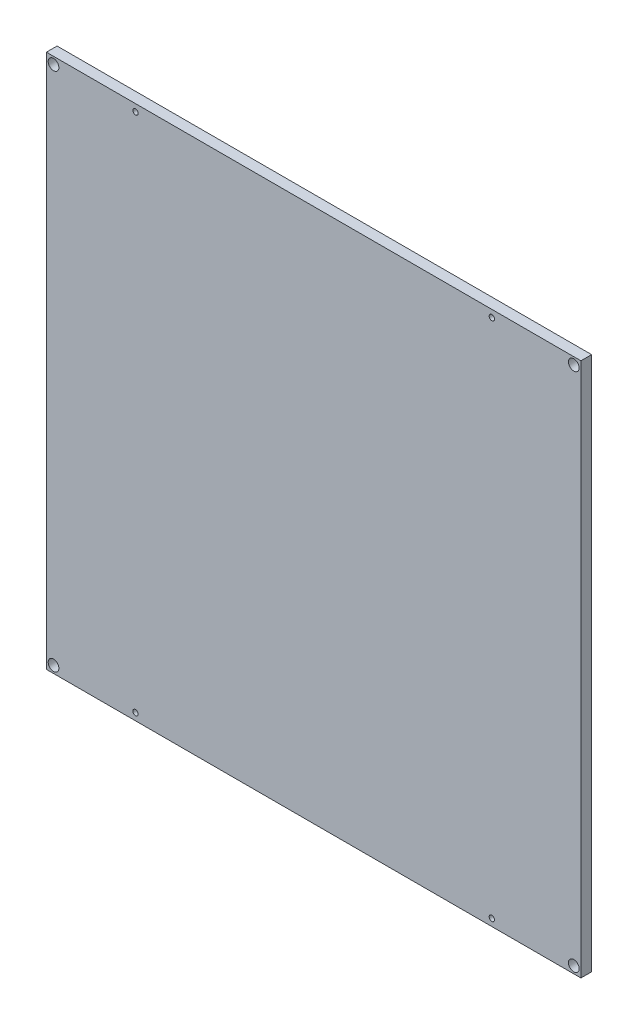
ISO-10303-21;
HEADER;
FILE_DESCRIPTION(('STEP AP214'),'2;1');
FILE_NAME('part.step','',(''),(''),'','','');
FILE_SCHEMA(('AUTOMOTIVE_DESIGN { 1 0 10303 214 1 1 1 1 }'));
ENDSEC;
DATA;
#1=APPLICATION_CONTEXT('core data for automotive mechanical design processes');
#2=APPLICATION_PROTOCOL_DEFINITION('international standard','automotive_design',2000,#1);
#3=PRODUCT_CONTEXT('',#1,'mechanical');
#4=PRODUCT('Part','Part','',(#3));
#5=PRODUCT_RELATED_PRODUCT_CATEGORY('part','',(#4));
#6=PRODUCT_DEFINITION_FORMATION('','',#4);
#7=PRODUCT_DEFINITION_CONTEXT('part definition',#1,'design');
#8=PRODUCT_DEFINITION('design','',#6,#7);
#9=PRODUCT_DEFINITION_SHAPE('','',#8);
#10=(LENGTH_UNIT() NAMED_UNIT(*) SI_UNIT(.MILLI.,.METRE.));
#11=(NAMED_UNIT(*) PLANE_ANGLE_UNIT() SI_UNIT($,.RADIAN.));
#12=(NAMED_UNIT(*) SI_UNIT($,.STERADIAN.) SOLID_ANGLE_UNIT());
#13=UNCERTAINTY_MEASURE_WITH_UNIT(LENGTH_MEASURE(1.E-05),#10,'distance_accuracy_value','');
#14=(GEOMETRIC_REPRESENTATION_CONTEXT(3) GLOBAL_UNCERTAINTY_ASSIGNED_CONTEXT((#13)) GLOBAL_UNIT_ASSIGNED_CONTEXT((#10,
#11,#12)) REPRESENTATION_CONTEXT('',''));
#15=CARTESIAN_POINT('',(0.,0.,0.));
#16=DIRECTION('',(0.,0.,1.));
#17=DIRECTION('',(1.,0.,0.));
#18=AXIS2_PLACEMENT_3D('',#15,#16,#17);
#19=CARTESIAN_POINT('',(0.,0.,6.));
#20=DIRECTION('',(0.,0.,-1.));
#21=DIRECTION('',(-1.,0.,0.));
#22=AXIS2_PLACEMENT_3D('',#19,#20,#21);
#23=PLANE('',#22);
#24=CARTESIAN_POINT('',(-146.,-146.,6.));
#25=DIRECTION('',(0.,0.,1.));
#26=DIRECTION('',(-1.,0.,0.));
#27=AXIS2_PLACEMENT_3D('',#24,#25,#26);
#28=CIRCLE('',#27,2.99999999999999);
#29=CARTESIAN_POINT('',(-149.,-146.,6.));
#30=VERTEX_POINT('',#29);
#31=EDGE_CURVE('E132',#30,#30,#28,.T.);
#32=ORIENTED_EDGE('',*,*,#31,.F.);
#33=EDGE_LOOP('',(#32));
#34=FACE_BOUND('',#33,.T.);
#35=CARTESIAN_POINT('',(100.,146.,6.));
#36=DIRECTION('',(0.,0.,-1.));
#37=DIRECTION('',(-1.,0.,0.));
#38=AXIS2_PLACEMENT_3D('',#35,#36,#37);
#39=CIRCLE('',#38,1.5);
#40=CARTESIAN_POINT('',(98.5,146.,6.));
#41=VERTEX_POINT('',#40);
#42=EDGE_CURVE('E126',#41,#41,#39,.T.);
#43=ORIENTED_EDGE('',*,*,#42,.T.);
#44=EDGE_LOOP('',(#43));
#45=FACE_BOUND('',#44,.T.);
#46=CARTESIAN_POINT('',(-100.,146.,6.));
#47=DIRECTION('',(0.,0.,1.));
#48=DIRECTION('',(1.,0.,0.));
#49=AXIS2_PLACEMENT_3D('',#46,#47,#48);
#50=CIRCLE('',#49,1.5);
#51=CARTESIAN_POINT('',(-98.5,146.,6.));
#52=VERTEX_POINT('',#51);
#53=EDGE_CURVE('E114',#52,#52,#50,.T.);
#54=ORIENTED_EDGE('',*,*,#53,.F.);
#55=EDGE_LOOP('',(#54));
#56=FACE_BOUND('',#55,.T.);
#57=CARTESIAN_POINT('',(-146.,146.,6.));
#58=DIRECTION('',(0.,0.,-1.));
#59=DIRECTION('',(-1.,0.,0.));
#60=AXIS2_PLACEMENT_3D('',#57,#58,#59);
#61=CIRCLE('',#60,2.99999999999999);
#62=CARTESIAN_POINT('',(-149.,146.,6.));
#63=VERTEX_POINT('',#62);
#64=EDGE_CURVE('E99',#63,#63,#61,.T.);
#65=ORIENTED_EDGE('',*,*,#64,.T.);
#66=EDGE_LOOP('',(#65));
#67=FACE_BOUND('',#66,.T.);
#68=DIRECTION('',(0.,1.,0.));
#69=VECTOR('',#68,1.);
#70=CARTESIAN_POINT('',(150.,-150.,6.));
#71=LINE('',#70,#69);
#72=CARTESIAN_POINT('',(150.,-150.,6.));
#73=VERTEX_POINT('',#72);
#74=CARTESIAN_POINT('',(150.,150.,6.));
#75=VERTEX_POINT('',#74);
#76=EDGE_CURVE('E84',#73,#75,#71,.T.);
#77=ORIENTED_EDGE('',*,*,#76,.T.);
#78=DIRECTION('',(-1.,0.,0.));
#79=VECTOR('',#78,1.);
#80=CARTESIAN_POINT('',(-150.,150.,6.));
#81=LINE('',#80,#79);
#82=CARTESIAN_POINT('',(-150.,150.,6.));
#83=VERTEX_POINT('',#82);
#84=EDGE_CURVE('E79',#75,#83,#81,.T.);
#85=ORIENTED_EDGE('',*,*,#84,.T.);
#86=DIRECTION('',(0.,-1.,0.));
#87=VECTOR('',#86,1.);
#88=CARTESIAN_POINT('',(-150.,-150.,6.));
#89=LINE('',#88,#87);
#90=CARTESIAN_POINT('',(-150.,-150.,6.));
#91=VERTEX_POINT('',#90);
#92=EDGE_CURVE('E82',#83,#91,#89,.T.);
#93=ORIENTED_EDGE('',*,*,#92,.T.);
#94=DIRECTION('',(1.,0.,0.));
#95=VECTOR('',#94,1.);
#96=CARTESIAN_POINT('',(-150.,-150.,6.));
#97=LINE('',#96,#95);
#98=EDGE_CURVE('E49',#91,#73,#97,.T.);
#99=ORIENTED_EDGE('',*,*,#98,.T.);
#100=EDGE_LOOP('',(#77,#85,#93,#99));
#101=FACE_BOUND('',#100,.T.);
#102=CARTESIAN_POINT('',(146.,146.,6.));
#103=DIRECTION('',(0.,0.,1.));
#104=DIRECTION('',(1.,0.,0.));
#105=AXIS2_PLACEMENT_3D('',#102,#103,#104);
#106=CIRCLE('',#105,2.99999999999999);
#107=CARTESIAN_POINT('',(149.,146.,6.));
#108=VERTEX_POINT('',#107);
#109=EDGE_CURVE('E120',#108,#108,#106,.T.);
#110=ORIENTED_EDGE('',*,*,#109,.F.);
#111=EDGE_LOOP('',(#110));
#112=FACE_BOUND('',#111,.T.);
#113=CARTESIAN_POINT('',(-100.,-146.,6.));
#114=DIRECTION('',(0.,0.,-1.));
#115=DIRECTION('',(1.,0.,0.));
#116=AXIS2_PLACEMENT_3D('',#113,#114,#115);
#117=CIRCLE('',#116,1.5);
#118=CARTESIAN_POINT('',(-98.5,-146.,6.));
#119=VERTEX_POINT('',#118);
#120=EDGE_CURVE('E138',#119,#119,#117,.T.);
#121=ORIENTED_EDGE('',*,*,#120,.T.);
#122=EDGE_LOOP('',(#121));
#123=FACE_BOUND('',#122,.T.);
#124=CARTESIAN_POINT('',(146.,-146.,6.));
#125=DIRECTION('',(0.,0.,-1.));
#126=DIRECTION('',(1.,0.,0.));
#127=AXIS2_PLACEMENT_3D('',#124,#125,#126);
#128=CIRCLE('',#127,2.99999999999999);
#129=CARTESIAN_POINT('',(149.,-146.,6.));
#130=VERTEX_POINT('',#129);
#131=EDGE_CURVE('E144',#130,#130,#128,.T.);
#132=ORIENTED_EDGE('',*,*,#131,.T.);
#133=EDGE_LOOP('',(#132));
#134=FACE_BOUND('',#133,.T.);
#135=CARTESIAN_POINT('',(100.,-146.,6.));
#136=DIRECTION('',(0.,0.,1.));
#137=DIRECTION('',(-1.,0.,0.));
#138=AXIS2_PLACEMENT_3D('',#135,#136,#137);
#139=CIRCLE('',#138,1.5);
#140=CARTESIAN_POINT('',(98.5,-146.,6.));
#141=VERTEX_POINT('',#140);
#142=EDGE_CURVE('E150',#141,#141,#139,.T.);
#143=ORIENTED_EDGE('',*,*,#142,.F.);
#144=EDGE_LOOP('',(#143));
#145=FACE_BOUND('',#144,.T.);
#146=ADVANCED_FACE('F32',(#34,#45,#56,#67,#101,#112,#123,#134,#145),#23,.F.);
#147=CARTESIAN_POINT('',(0.,0.,0.));
#148=DIRECTION('',(0.,0.,-1.));
#149=DIRECTION('',(-1.,0.,0.));
#150=AXIS2_PLACEMENT_3D('',#147,#148,#149);
#151=PLANE('',#150);
#152=CARTESIAN_POINT('',(-146.,-146.,0.));
#153=DIRECTION('',(0.,0.,1.));
#154=DIRECTION('',(-1.,0.,0.));
#155=AXIS2_PLACEMENT_3D('',#152,#153,#154);
#156=CIRCLE('',#155,2.99999999999999);
#157=CARTESIAN_POINT('',(-149.,-146.,0.));
#158=VERTEX_POINT('',#157);
#159=EDGE_CURVE('E135',#158,#158,#156,.T.);
#160=ORIENTED_EDGE('',*,*,#159,.T.);
#161=EDGE_LOOP('',(#160));
#162=FACE_BOUND('',#161,.T.);
#163=CARTESIAN_POINT('',(100.,146.,0.));
#164=DIRECTION('',(0.,0.,-1.));
#165=DIRECTION('',(-1.,0.,0.));
#166=AXIS2_PLACEMENT_3D('',#163,#164,#165);
#167=CIRCLE('',#166,1.5);
#168=CARTESIAN_POINT('',(98.5,146.,0.));
#169=VERTEX_POINT('',#168);
#170=EDGE_CURVE('E129',#169,#169,#167,.T.);
#171=ORIENTED_EDGE('',*,*,#170,.F.);
#172=EDGE_LOOP('',(#171));
#173=FACE_BOUND('',#172,.T.);
#174=CARTESIAN_POINT('',(-100.,146.,0.));
#175=DIRECTION('',(0.,0.,1.));
#176=DIRECTION('',(1.,0.,0.));
#177=AXIS2_PLACEMENT_3D('',#174,#175,#176);
#178=CIRCLE('',#177,1.5);
#179=CARTESIAN_POINT('',(-98.5,146.,0.));
#180=VERTEX_POINT('',#179);
#181=EDGE_CURVE('E117',#180,#180,#178,.T.);
#182=ORIENTED_EDGE('',*,*,#181,.T.);
#183=EDGE_LOOP('',(#182));
#184=FACE_BOUND('',#183,.T.);
#185=CARTESIAN_POINT('',(-146.,146.,0.));
#186=DIRECTION('',(0.,0.,-1.));
#187=DIRECTION('',(-1.,0.,0.));
#188=AXIS2_PLACEMENT_3D('',#185,#186,#187);
#189=CIRCLE('',#188,2.99999999999999);
#190=CARTESIAN_POINT('',(-149.,146.,0.));
#191=VERTEX_POINT('',#190);
#192=EDGE_CURVE('E111',#191,#191,#189,.T.);
#193=ORIENTED_EDGE('',*,*,#192,.F.);
#194=EDGE_LOOP('',(#193));
#195=FACE_BOUND('',#194,.T.);
#196=DIRECTION('',(0.,1.,0.));
#197=VECTOR('',#196,1.);
#198=CARTESIAN_POINT('',(150.,-150.,0.));
#199=LINE('',#198,#197);
#200=CARTESIAN_POINT('',(150.,-150.,0.));
#201=VERTEX_POINT('',#200);
#202=CARTESIAN_POINT('',(150.,150.,0.));
#203=VERTEX_POINT('',#202);
#204=EDGE_CURVE('E96',#201,#203,#199,.T.);
#205=ORIENTED_EDGE('',*,*,#204,.F.);
#206=DIRECTION('',(1.,0.,0.));
#207=VECTOR('',#206,1.);
#208=CARTESIAN_POINT('',(-150.,-150.,0.));
#209=LINE('',#208,#207);
#210=CARTESIAN_POINT('',(-150.,-150.,0.));
#211=VERTEX_POINT('',#210);
#212=EDGE_CURVE('E72',#211,#201,#209,.T.);
#213=ORIENTED_EDGE('',*,*,#212,.F.);
#214=DIRECTION('',(0.,-1.,0.));
#215=VECTOR('',#214,1.);
#216=CARTESIAN_POINT('',(-150.,-150.,0.));
#217=LINE('',#216,#215);
#218=CARTESIAN_POINT('',(-150.,150.,0.));
#219=VERTEX_POINT('',#218);
#220=EDGE_CURVE('E66',#219,#211,#217,.T.);
#221=ORIENTED_EDGE('',*,*,#220,.F.);
#222=DIRECTION('',(-1.,0.,0.));
#223=VECTOR('',#222,1.);
#224=CARTESIAN_POINT('',(-150.,150.,0.));
#225=LINE('',#224,#223);
#226=EDGE_CURVE('E88',#203,#219,#225,.T.);
#227=ORIENTED_EDGE('',*,*,#226,.F.);
#228=EDGE_LOOP('',(#205,#213,#221,#227));
#229=FACE_BOUND('',#228,.T.);
#230=CARTESIAN_POINT('',(146.,146.,0.));
#231=DIRECTION('',(0.,0.,1.));
#232=DIRECTION('',(1.,0.,0.));
#233=AXIS2_PLACEMENT_3D('',#230,#231,#232);
#234=CIRCLE('',#233,2.99999999999999);
#235=CARTESIAN_POINT('',(149.,146.,0.));
#236=VERTEX_POINT('',#235);
#237=EDGE_CURVE('E123',#236,#236,#234,.T.);
#238=ORIENTED_EDGE('',*,*,#237,.T.);
#239=EDGE_LOOP('',(#238));
#240=FACE_BOUND('',#239,.T.);
#241=CARTESIAN_POINT('',(-100.,-146.,0.));
#242=DIRECTION('',(0.,0.,-1.));
#243=DIRECTION('',(1.,0.,0.));
#244=AXIS2_PLACEMENT_3D('',#241,#242,#243);
#245=CIRCLE('',#244,1.5);
#246=CARTESIAN_POINT('',(-98.5,-146.,0.));
#247=VERTEX_POINT('',#246);
#248=EDGE_CURVE('E141',#247,#247,#245,.T.);
#249=ORIENTED_EDGE('',*,*,#248,.F.);
#250=EDGE_LOOP('',(#249));
#251=FACE_BOUND('',#250,.T.);
#252=CARTESIAN_POINT('',(146.,-146.,0.));
#253=DIRECTION('',(0.,0.,-1.));
#254=DIRECTION('',(1.,0.,0.));
#255=AXIS2_PLACEMENT_3D('',#252,#253,#254);
#256=CIRCLE('',#255,2.99999999999999);
#257=CARTESIAN_POINT('',(149.,-146.,0.));
#258=VERTEX_POINT('',#257);
#259=EDGE_CURVE('E147',#258,#258,#256,.T.);
#260=ORIENTED_EDGE('',*,*,#259,.F.);
#261=EDGE_LOOP('',(#260));
#262=FACE_BOUND('',#261,.T.);
#263=CARTESIAN_POINT('',(100.,-146.,0.));
#264=DIRECTION('',(0.,0.,1.));
#265=DIRECTION('',(-1.,0.,0.));
#266=AXIS2_PLACEMENT_3D('',#263,#264,#265);
#267=CIRCLE('',#266,1.5);
#268=CARTESIAN_POINT('',(98.5,-146.,0.));
#269=VERTEX_POINT('',#268);
#270=EDGE_CURVE('E153',#269,#269,#267,.T.);
#271=ORIENTED_EDGE('',*,*,#270,.T.);
#272=EDGE_LOOP('',(#271));
#273=FACE_BOUND('',#272,.T.);
#274=ADVANCED_FACE('F107',(#162,#173,#184,#195,#229,#240,#251,#262,#273),#151,.T.);
#275=CARTESIAN_POINT('',(150.,-150.,6.));
#276=DIRECTION('',(-1.,0.,0.));
#277=DIRECTION('',(0.,0.,1.));
#278=AXIS2_PLACEMENT_3D('',#275,#276,#277);
#279=PLANE('',#278);
#280=ORIENTED_EDGE('',*,*,#204,.T.);
#281=DIRECTION('',(0.,0.,-1.));
#282=VECTOR('',#281,1.);
#283=CARTESIAN_POINT('',(150.,150.,6.));
#284=LINE('',#283,#282);
#285=EDGE_CURVE('E11',#75,#203,#284,.T.);
#286=ORIENTED_EDGE('',*,*,#285,.F.);
#287=ORIENTED_EDGE('',*,*,#76,.F.);
#288=DIRECTION('',(0.,0.,-1.));
#289=VECTOR('',#288,1.);
#290=CARTESIAN_POINT('',(150.,-150.,6.));
#291=LINE('',#290,#289);
#292=EDGE_CURVE('E92',#73,#201,#291,.T.);
#293=ORIENTED_EDGE('',*,*,#292,.T.);
#294=EDGE_LOOP('',(#280,#286,#287,#293));
#295=FACE_BOUND('',#294,.T.);
#296=ADVANCED_FACE('F34',(#295),#279,.F.);
#297=CARTESIAN_POINT('',(-150.,150.,6.));
#298=DIRECTION('',(0.,-1.,0.));
#299=DIRECTION('',(0.,0.,-1.));
#300=AXIS2_PLACEMENT_3D('',#297,#298,#299);
#301=PLANE('',#300);
#302=ORIENTED_EDGE('',*,*,#226,.T.);
#303=DIRECTION('',(0.,0.,-1.));
#304=VECTOR('',#303,1.);
#305=CARTESIAN_POINT('',(-150.,150.,6.));
#306=LINE('',#305,#304);
#307=EDGE_CURVE('E41',#83,#219,#306,.T.);
#308=ORIENTED_EDGE('',*,*,#307,.F.);
#309=ORIENTED_EDGE('',*,*,#84,.F.);
#310=ORIENTED_EDGE('',*,*,#285,.T.);
#311=EDGE_LOOP('',(#302,#308,#309,#310));
#312=FACE_BOUND('',#311,.T.);
#313=ADVANCED_FACE('F87',(#312),#301,.F.);
#314=CARTESIAN_POINT('',(-150.,-150.,6.));
#315=DIRECTION('',(1.,0.,0.));
#316=DIRECTION('',(0.,0.,-1.));
#317=AXIS2_PLACEMENT_3D('',#314,#315,#316);
#318=PLANE('',#317);
#319=ORIENTED_EDGE('',*,*,#220,.T.);
#320=DIRECTION('',(0.,0.,-1.));
#321=VECTOR('',#320,1.);
#322=CARTESIAN_POINT('',(-150.,-150.,6.));
#323=LINE('',#322,#321);
#324=EDGE_CURVE('E89',#91,#211,#323,.T.);
#325=ORIENTED_EDGE('',*,*,#324,.F.);
#326=ORIENTED_EDGE('',*,*,#92,.F.);
#327=ORIENTED_EDGE('',*,*,#307,.T.);
#328=EDGE_LOOP('',(#319,#325,#326,#327));
#329=FACE_BOUND('',#328,.T.);
#330=ADVANCED_FACE('F90',(#329),#318,.F.);
#331=CARTESIAN_POINT('',(-150.,-150.,6.));
#332=DIRECTION('',(0.,1.,0.));
#333=DIRECTION('',(0.,0.,1.));
#334=AXIS2_PLACEMENT_3D('',#331,#332,#333);
#335=PLANE('',#334);
#336=ORIENTED_EDGE('',*,*,#212,.T.);
#337=ORIENTED_EDGE('',*,*,#292,.F.);
#338=ORIENTED_EDGE('',*,*,#98,.F.);
#339=ORIENTED_EDGE('',*,*,#324,.T.);
#340=EDGE_LOOP('',(#336,#337,#338,#339));
#341=FACE_BOUND('',#340,.T.);
#342=ADVANCED_FACE('F104',(#341),#335,.F.);
#343=CARTESIAN_POINT('',(-146.,146.,6.));
#344=DIRECTION('',(0.,0.,-1.));
#345=DIRECTION('',(-1.,0.,0.));
#346=AXIS2_PLACEMENT_3D('',#343,#344,#345);
#347=CYLINDRICAL_SURFACE('',#346,2.99999999999999);
#348=ORIENTED_EDGE('',*,*,#64,.F.);
#349=EDGE_LOOP('',(#348));
#350=FACE_BOUND('',#349,.T.);
#351=ORIENTED_EDGE('',*,*,#192,.T.);
#352=EDGE_LOOP('',(#351));
#353=FACE_BOUND('',#352,.T.);
#354=ADVANCED_FACE('F173',(#350,#353),#347,.F.);
#355=CARTESIAN_POINT('',(-100.,146.,6.));
#356=DIRECTION('',(0.,0.,-1.));
#357=DIRECTION('',(-1.,0.,0.));
#358=AXIS2_PLACEMENT_3D('',#355,#356,#357);
#359=CYLINDRICAL_SURFACE('',#358,1.5);
#360=ORIENTED_EDGE('',*,*,#53,.T.);
#361=EDGE_LOOP('',(#360));
#362=FACE_BOUND('',#361,.T.);
#363=ORIENTED_EDGE('',*,*,#181,.F.);
#364=EDGE_LOOP('',(#363));
#365=FACE_BOUND('',#364,.T.);
#366=ADVANCED_FACE('F244',(#362,#365),#359,.F.);
#367=CARTESIAN_POINT('',(146.,146.,6.));
#368=DIRECTION('',(0.,0.,-1.));
#369=DIRECTION('',(-1.,0.,0.));
#370=AXIS2_PLACEMENT_3D('',#367,#368,#369);
#371=CYLINDRICAL_SURFACE('',#370,2.99999999999999);
#372=ORIENTED_EDGE('',*,*,#109,.T.);
#373=EDGE_LOOP('',(#372));
#374=FACE_BOUND('',#373,.T.);
#375=ORIENTED_EDGE('',*,*,#237,.F.);
#376=EDGE_LOOP('',(#375));
#377=FACE_BOUND('',#376,.T.);
#378=ADVANCED_FACE('F241',(#374,#377),#371,.F.);
#379=CARTESIAN_POINT('',(100.,146.,6.));
#380=DIRECTION('',(0.,0.,-1.));
#381=DIRECTION('',(-1.,0.,0.));
#382=AXIS2_PLACEMENT_3D('',#379,#380,#381);
#383=CYLINDRICAL_SURFACE('',#382,1.5);
#384=ORIENTED_EDGE('',*,*,#42,.F.);
#385=EDGE_LOOP('',(#384));
#386=FACE_BOUND('',#385,.T.);
#387=ORIENTED_EDGE('',*,*,#170,.T.);
#388=EDGE_LOOP('',(#387));
#389=FACE_BOUND('',#388,.T.);
#390=ADVANCED_FACE('F204',(#386,#389),#383,.F.);
#391=CARTESIAN_POINT('',(-146.,-146.,6.));
#392=DIRECTION('',(0.,0.,-1.));
#393=DIRECTION('',(-1.,0.,0.));
#394=AXIS2_PLACEMENT_3D('',#391,#392,#393);
#395=CYLINDRICAL_SURFACE('',#394,2.99999999999999);
#396=ORIENTED_EDGE('',*,*,#31,.T.);
#397=EDGE_LOOP('',(#396));
#398=FACE_BOUND('',#397,.T.);
#399=ORIENTED_EDGE('',*,*,#159,.F.);
#400=EDGE_LOOP('',(#399));
#401=FACE_BOUND('',#400,.T.);
#402=ADVANCED_FACE('F198',(#398,#401),#395,.F.);
#403=CARTESIAN_POINT('',(-100.,-146.,6.));
#404=DIRECTION('',(0.,0.,-1.));
#405=DIRECTION('',(-1.,0.,0.));
#406=AXIS2_PLACEMENT_3D('',#403,#404,#405);
#407=CYLINDRICAL_SURFACE('',#406,1.5);
#408=ORIENTED_EDGE('',*,*,#120,.F.);
#409=EDGE_LOOP('',(#408));
#410=FACE_BOUND('',#409,.T.);
#411=ORIENTED_EDGE('',*,*,#248,.T.);
#412=EDGE_LOOP('',(#411));
#413=FACE_BOUND('',#412,.T.);
#414=ADVANCED_FACE('F203',(#410,#413),#407,.F.);
#415=CARTESIAN_POINT('',(146.,-146.,6.));
#416=DIRECTION('',(0.,0.,-1.));
#417=DIRECTION('',(-1.,0.,0.));
#418=AXIS2_PLACEMENT_3D('',#415,#416,#417);
#419=CYLINDRICAL_SURFACE('',#418,2.99999999999999);
#420=ORIENTED_EDGE('',*,*,#131,.F.);
#421=EDGE_LOOP('',(#420));
#422=FACE_BOUND('',#421,.T.);
#423=ORIENTED_EDGE('',*,*,#259,.T.);
#424=EDGE_LOOP('',(#423));
#425=FACE_BOUND('',#424,.T.);
#426=ADVANCED_FACE('F216',(#422,#425),#419,.F.);
#427=CARTESIAN_POINT('',(100.,-146.,6.));
#428=DIRECTION('',(0.,0.,-1.));
#429=DIRECTION('',(-1.,0.,0.));
#430=AXIS2_PLACEMENT_3D('',#427,#428,#429);
#431=CYLINDRICAL_SURFACE('',#430,1.5);
#432=ORIENTED_EDGE('',*,*,#142,.T.);
#433=EDGE_LOOP('',(#432));
#434=FACE_BOUND('',#433,.T.);
#435=ORIENTED_EDGE('',*,*,#270,.F.);
#436=EDGE_LOOP('',(#435));
#437=FACE_BOUND('',#436,.T.);
#438=ADVANCED_FACE('F159',(#434,#437),#431,.F.);
#439=CLOSED_SHELL('',(#146,#274,#296,#313,#330,#342,#354,#366,#378,#390,#402,#414,#426,#438));
#440=MANIFOLD_SOLID_BREP('B2',#439);
#441=ADVANCED_BREP_SHAPE_REPRESENTATION('',(#18,#440),#14);
#442=SHAPE_DEFINITION_REPRESENTATION(#9,#441);
ENDSEC;
END-ISO-10303-21;
